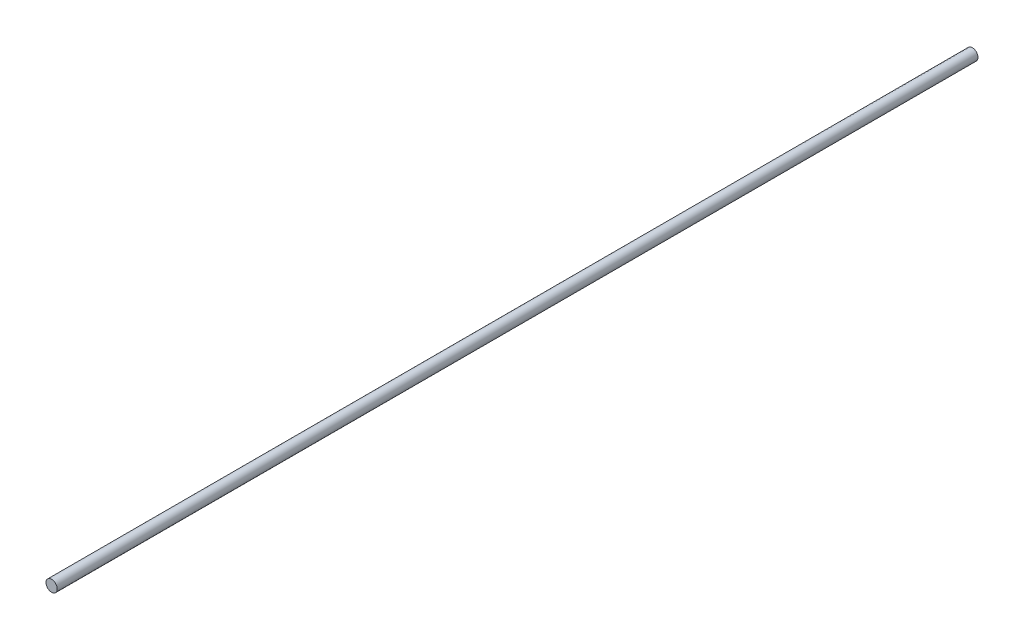
ISO-10303-21;
HEADER;
FILE_DESCRIPTION(('STEP AP214'),'2;1');
FILE_NAME('part.step','',(''),(''),'','','');
FILE_SCHEMA(('AUTOMOTIVE_DESIGN { 1 0 10303 214 1 1 1 1 }'));
ENDSEC;
DATA;
#1=APPLICATION_CONTEXT('core data for automotive mechanical design processes');
#2=APPLICATION_PROTOCOL_DEFINITION('international standard','automotive_design',2000,#1);
#3=PRODUCT_CONTEXT('',#1,'mechanical');
#4=PRODUCT('Part','Part','',(#3));
#5=PRODUCT_RELATED_PRODUCT_CATEGORY('part','',(#4));
#6=PRODUCT_DEFINITION_FORMATION('','',#4);
#7=PRODUCT_DEFINITION_CONTEXT('part definition',#1,'design');
#8=PRODUCT_DEFINITION('design','',#6,#7);
#9=PRODUCT_DEFINITION_SHAPE('','',#8);
#10=(LENGTH_UNIT() NAMED_UNIT(*) SI_UNIT(.MILLI.,.METRE.));
#11=(NAMED_UNIT(*) PLANE_ANGLE_UNIT() SI_UNIT($,.RADIAN.));
#12=(NAMED_UNIT(*) SI_UNIT($,.STERADIAN.) SOLID_ANGLE_UNIT());
#13=UNCERTAINTY_MEASURE_WITH_UNIT(LENGTH_MEASURE(1.E-05),#10,'distance_accuracy_value','');
#14=(GEOMETRIC_REPRESENTATION_CONTEXT(3) GLOBAL_UNCERTAINTY_ASSIGNED_CONTEXT((#13)) GLOBAL_UNIT_ASSIGNED_CONTEXT((#10,
#11,#12)) REPRESENTATION_CONTEXT('',''));
#15=CARTESIAN_POINT('',(0.,0.,0.));
#16=DIRECTION('',(0.,0.,1.));
#17=DIRECTION('',(1.,0.,0.));
#18=AXIS2_PLACEMENT_3D('',#15,#16,#17);
#19=CARTESIAN_POINT('',(0.,0.,640.));
#20=DIRECTION('',(0.,0.,-1.));
#21=DIRECTION('',(-1.,0.,0.));
#22=AXIS2_PLACEMENT_3D('',#19,#20,#21);
#23=CYLINDRICAL_SURFACE('',#22,4.);
#24=CARTESIAN_POINT('',(0.,0.,0.));
#25=DIRECTION('',(0.,0.,1.));
#26=DIRECTION('',(1.,0.,0.));
#27=AXIS2_PLACEMENT_3D('',#24,#25,#26);
#28=CIRCLE('',#27,4.);
#29=CARTESIAN_POINT('',(4.,0.,0.));
#30=VERTEX_POINT('',#29);
#31=EDGE_CURVE('E10',#30,#30,#28,.T.);
#32=ORIENTED_EDGE('',*,*,#31,.T.);
#33=EDGE_LOOP('',(#32));
#34=FACE_BOUND('',#33,.T.);
#35=CARTESIAN_POINT('',(0.,0.,653.91));
#36=DIRECTION('',(0.,0.,1.));
#37=DIRECTION('',(1.,0.,0.));
#38=AXIS2_PLACEMENT_3D('',#35,#36,#37);
#39=CIRCLE('',#38,4.);
#40=CARTESIAN_POINT('',(4.,0.,653.91));
#41=VERTEX_POINT('',#40);
#42=EDGE_CURVE('E37',#41,#41,#39,.T.);
#43=ORIENTED_EDGE('',*,*,#42,.F.);
#44=EDGE_LOOP('',(#43));
#45=FACE_BOUND('',#44,.T.);
#46=ADVANCED_FACE('F31',(#34,#45),#23,.T.);
#47=CARTESIAN_POINT('',(0.,0.,0.));
#48=DIRECTION('',(0.,0.,1.));
#49=DIRECTION('',(1.,0.,0.));
#50=AXIS2_PLACEMENT_3D('',#47,#48,#49);
#51=PLANE('',#50);
#52=ORIENTED_EDGE('',*,*,#31,.F.);
#53=EDGE_LOOP('',(#52));
#54=FACE_BOUND('',#53,.T.);
#55=ADVANCED_FACE('F46',(#54),#51,.F.);
#56=CARTESIAN_POINT('',(0.,0.,653.91));
#57=DIRECTION('',(0.,0.,1.));
#58=DIRECTION('',(1.,0.,0.));
#59=AXIS2_PLACEMENT_3D('',#56,#57,#58);
#60=PLANE('',#59);
#61=ORIENTED_EDGE('',*,*,#42,.T.);
#62=EDGE_LOOP('',(#61));
#63=FACE_BOUND('',#62,.T.);
#64=ADVANCED_FACE('F43',(#63),#60,.T.);
#65=CLOSED_SHELL('',(#46,#55,#64));
#66=MANIFOLD_SOLID_BREP('B2',#65);
#67=ADVANCED_BREP_SHAPE_REPRESENTATION('',(#18,#66),#14);
#68=SHAPE_DEFINITION_REPRESENTATION(#9,#67);
ENDSEC;
END-ISO-10303-21;
